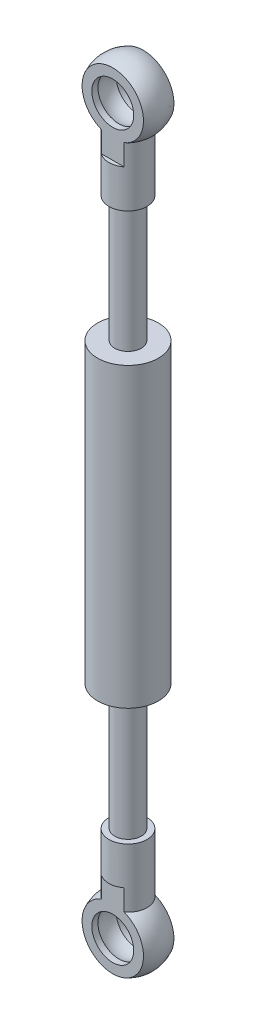
ISO-10303-21;
HEADER;
FILE_DESCRIPTION(('STEP AP214'),'2;1');
FILE_NAME('part.step','',(''),(''),'','','');
FILE_SCHEMA(('AUTOMOTIVE_DESIGN { 1 0 10303 214 1 1 1 1 }'));
ENDSEC;
DATA;
#1=APPLICATION_CONTEXT('core data for automotive mechanical design processes');
#2=APPLICATION_PROTOCOL_DEFINITION('international standard','automotive_design',2000,#1);
#3=PRODUCT_CONTEXT('',#1,'mechanical');
#4=PRODUCT('Part','Part','',(#3));
#5=PRODUCT_RELATED_PRODUCT_CATEGORY('part','',(#4));
#6=PRODUCT_DEFINITION_FORMATION('','',#4);
#7=PRODUCT_DEFINITION_CONTEXT('part definition',#1,'design');
#8=PRODUCT_DEFINITION('design','',#6,#7);
#9=PRODUCT_DEFINITION_SHAPE('','',#8);
#10=(LENGTH_UNIT() NAMED_UNIT(*) SI_UNIT(.MILLI.,.METRE.));
#11=(NAMED_UNIT(*) PLANE_ANGLE_UNIT() SI_UNIT($,.RADIAN.));
#12=(NAMED_UNIT(*) SI_UNIT($,.STERADIAN.) SOLID_ANGLE_UNIT());
#13=UNCERTAINTY_MEASURE_WITH_UNIT(LENGTH_MEASURE(1.E-05),#10,'distance_accuracy_value','');
#14=(GEOMETRIC_REPRESENTATION_CONTEXT(3) GLOBAL_UNCERTAINTY_ASSIGNED_CONTEXT((#13)) GLOBAL_UNIT_ASSIGNED_CONTEXT((#10,
#11,#12)) REPRESENTATION_CONTEXT('',''));
#15=CARTESIAN_POINT('',(0.,0.,0.));
#16=DIRECTION('',(0.,0.,1.));
#17=DIRECTION('',(1.,0.,0.));
#18=AXIS2_PLACEMENT_3D('',#15,#16,#17);
#19=CARTESIAN_POINT('',(0.,-47.4999999999999,0.));
#20=DIRECTION('',(0.,-1.,0.));
#21=DIRECTION('',(1.,0.,0.));
#22=AXIS2_PLACEMENT_3D('',#19,#20,#21);
#23=SPHERICAL_SURFACE('',#22,4.49999999999999);
#24=CARTESIAN_POINT('',(1.51186213114404E-13,-43.758342613226,0.));
#25=DIRECTION('',(0.,-1.,0.));
#26=DIRECTION('',(1.,0.,0.));
#27=AXIS2_PLACEMENT_3D('',#24,#25,#26);
#28=CIRCLE('',#27,2.49999999999985);
#29=CARTESIAN_POINT('',(1.49999999999976,-43.758342613226,-2.00000000000012));
#30=VERTEX_POINT('',#29);
#31=CARTESIAN_POINT('',(1.49999999999996,-43.758342613226,2.00000000000001));
#32=VERTEX_POINT('',#31);
#33=EDGE_CURVE('E133',#30,#32,#28,.T.);
#34=ORIENTED_EDGE('',*,*,#33,.T.);
#35=CARTESIAN_POINT('',(0.,-47.4999999999999,2.00000000000001));
#36=DIRECTION('',(0.,0.,-1.));
#37=DIRECTION('',(0.,1.,0.));
#38=AXIS2_PLACEMENT_3D('',#35,#36,#37);
#39=CIRCLE('',#38,4.03112887414926);
#40=CARTESIAN_POINT('',(-1.49999999999946,-43.758342613226,2.00000000000012));
#41=VERTEX_POINT('',#40);
#42=EDGE_CURVE('E186',#32,#41,#39,.T.);
#43=ORIENTED_EDGE('',*,*,#42,.T.);
#44=CARTESIAN_POINT('',(-1.49999999999982,-43.758342613226,-2.00000000000001));
#45=VERTEX_POINT('',#44);
#46=EDGE_CURVE('E128',#41,#45,#28,.T.);
#47=ORIENTED_EDGE('',*,*,#46,.T.);
#48=CARTESIAN_POINT('',(0.,-47.4999999999999,-2.00000000000001));
#49=DIRECTION('',(0.,0.,1.));
#50=DIRECTION('',(0.,-1.,0.));
#51=AXIS2_PLACEMENT_3D('',#48,#49,#50);
#52=CIRCLE('',#51,4.03112887414926);
#53=EDGE_CURVE('E179',#45,#30,#52,.T.);
#54=ORIENTED_EDGE('',*,*,#53,.T.);
#55=EDGE_LOOP('',(#34,#43,#47,#54));
#56=FACE_BOUND('',#55,.T.);
#57=ADVANCED_FACE('F41',(#56),#23,.T.);
#58=CARTESIAN_POINT('',(3.43133320105825E-12,-1000.,0.));
#59=DIRECTION('',(0.,-1.,0.));
#60=DIRECTION('',(1.,0.,0.));
#61=AXIS2_PLACEMENT_3D('',#58,#59,#60);
#62=CYLINDRICAL_SURFACE('',#61,2.49999999999986);
#63=DIRECTION('',(0.,-1.,0.));
#64=VECTOR('',#63,1.);
#65=CARTESIAN_POINT('',(1.50000000000304,-1000.,2.00000000000012));
#66=LINE('',#65,#64);
#67=CARTESIAN_POINT('',(1.49999999999976,-41.,2.00000000000001));
#68=VERTEX_POINT('',#67);
#69=EDGE_CURVE('E189',#32,#68,#66,.F.);
#70=ORIENTED_EDGE('',*,*,#69,.F.);
#71=ORIENTED_EDGE('',*,*,#33,.F.);
#72=DIRECTION('',(0.,-1.,0.));
#73=VECTOR('',#72,1.);
#74=CARTESIAN_POINT('',(1.50000000000304,-1000.,-2.00000000000012));
#75=LINE('',#74,#73);
#76=CARTESIAN_POINT('',(1.4999999999999,-41.,-2.00000000000001));
#77=VERTEX_POINT('',#76);
#78=EDGE_CURVE('E177',#77,#30,#75,.T.);
#79=ORIENTED_EDGE('',*,*,#78,.F.);
#80=CARTESIAN_POINT('',(1.41724411126802E-13,-41.,0.));
#81=DIRECTION('',(0.,1.,0.));
#82=DIRECTION('',(0.,0.,1.));
#83=AXIS2_PLACEMENT_3D('',#80,#81,#82);
#84=CIRCLE('',#83,2.49999999999986);
#85=CARTESIAN_POINT('',(-1.49999999999962,-41.,-2.00000000000001));
#86=VERTEX_POINT('',#85);
#87=EDGE_CURVE('E49',#86,#77,#84,.F.);
#88=ORIENTED_EDGE('',*,*,#87,.F.);
#89=DIRECTION('',(0.,-1.,0.));
#90=VECTOR('',#89,1.);
#91=CARTESIAN_POINT('',(-1.49999999999618,-1000.,-2.00000000000012));
#92=LINE('',#91,#90);
#93=EDGE_CURVE('E182',#45,#86,#92,.F.);
#94=ORIENTED_EDGE('',*,*,#93,.F.);
#95=ORIENTED_EDGE('',*,*,#46,.F.);
#96=DIRECTION('',(0.,-1.,0.));
#97=VECTOR('',#96,1.);
#98=CARTESIAN_POINT('',(-1.49999999999618,-1000.,2.00000000000012));
#99=LINE('',#98,#97);
#100=CARTESIAN_POINT('',(-1.49999999999947,-41.,2.00000000000012));
#101=VERTEX_POINT('',#100);
#102=EDGE_CURVE('E184',#101,#41,#99,.T.);
#103=ORIENTED_EDGE('',*,*,#102,.F.);
#104=CARTESIAN_POINT('',(1.41724411126802E-13,-41.,0.));
#105=DIRECTION('',(0.,1.,0.));
#106=DIRECTION('',(0.,0.,1.));
#107=AXIS2_PLACEMENT_3D('',#104,#105,#106);
#108=CIRCLE('',#107,2.49999999999986);
#109=EDGE_CURVE('E11',#68,#101,#108,.F.);
#110=ORIENTED_EDGE('',*,*,#109,.F.);
#111=EDGE_LOOP('',(#70,#71,#79,#88,#94,#95,#103,#110));
#112=FACE_BOUND('',#111,.T.);
#113=CARTESIAN_POINT('',(1.24573166132373E-13,-36.,0.));
#114=DIRECTION('',(0.,-1.,0.));
#115=DIRECTION('',(1.,0.,0.));
#116=AXIS2_PLACEMENT_3D('',#113,#114,#115);
#117=CIRCLE('',#116,2.49999999999988);
#118=CARTESIAN_POINT('',(2.5,-36.,0.));
#119=VERTEX_POINT('',#118);
#120=EDGE_CURVE('E214',#119,#119,#117,.T.);
#121=ORIENTED_EDGE('',*,*,#120,.T.);
#122=EDGE_LOOP('',(#121));
#123=FACE_BOUND('',#122,.T.);
#124=ADVANCED_FACE('F225',(#112,#123),#62,.T.);
#125=CARTESIAN_POINT('',(0.,-36.,0.));
#126=DIRECTION('',(0.,-1.,0.));
#127=DIRECTION('',(1.,0.,0.));
#128=AXIS2_PLACEMENT_3D('',#125,#126,#127);
#129=PLANE('',#128);
#130=ORIENTED_EDGE('',*,*,#120,.F.);
#131=EDGE_LOOP('',(#130));
#132=FACE_BOUND('',#131,.T.);
#133=CARTESIAN_POINT('',(1.24573166132373E-13,-36.,0.));
#134=DIRECTION('',(0.,-1.,0.));
#135=DIRECTION('',(1.,0.,0.));
#136=AXIS2_PLACEMENT_3D('',#133,#134,#135);
#137=CIRCLE('',#136,1.74999999999988);
#138=CARTESIAN_POINT('',(1.75,-36.,0.));
#139=VERTEX_POINT('',#138);
#140=EDGE_CURVE('E212',#139,#139,#137,.T.);
#141=ORIENTED_EDGE('',*,*,#140,.T.);
#142=EDGE_LOOP('',(#141));
#143=FACE_BOUND('',#142,.T.);
#144=ADVANCED_FACE('F254',(#132,#143),#129,.F.);
#145=CARTESIAN_POINT('',(3.43133320105825E-12,-1000.,0.));
#146=DIRECTION('',(0.,-1.,0.));
#147=DIRECTION('',(1.,0.,0.));
#148=AXIS2_PLACEMENT_3D('',#145,#146,#147);
#149=CYLINDRICAL_SURFACE('',#148,1.7499999999999);
#150=ORIENTED_EDGE('',*,*,#140,.F.);
#151=EDGE_LOOP('',(#150));
#152=FACE_BOUND('',#151,.T.);
#153=CARTESIAN_POINT('',(0.,-19.5,0.));
#154=DIRECTION('',(0.,-1.,0.));
#155=DIRECTION('',(1.,0.,0.));
#156=AXIS2_PLACEMENT_3D('',#153,#154,#155);
#157=CIRCLE('',#156,1.74999999999993);
#158=CARTESIAN_POINT('',(1.75,-19.5,0.));
#159=VERTEX_POINT('',#158);
#160=EDGE_CURVE('E209',#159,#159,#157,.T.);
#161=ORIENTED_EDGE('',*,*,#160,.T.);
#162=EDGE_LOOP('',(#161));
#163=FACE_BOUND('',#162,.T.);
#164=ADVANCED_FACE('F259',(#152,#163),#149,.T.);
#165=CARTESIAN_POINT('',(0.,-19.5,0.));
#166=DIRECTION('',(0.,-1.,0.));
#167=DIRECTION('',(1.,0.,0.));
#168=AXIS2_PLACEMENT_3D('',#165,#166,#167);
#169=PLANE('',#168);
#170=CARTESIAN_POINT('',(0.,-19.5,0.));
#171=DIRECTION('',(0.,-1.,0.));
#172=DIRECTION('',(1.,0.,0.));
#173=AXIS2_PLACEMENT_3D('',#170,#171,#172);
#174=CIRCLE('',#173,3.99999999999994);
#175=CARTESIAN_POINT('',(4.,-19.4999999999999,0.));
#176=VERTEX_POINT('',#175);
#177=EDGE_CURVE('E206',#176,#176,#174,.T.);
#178=ORIENTED_EDGE('',*,*,#177,.T.);
#179=EDGE_LOOP('',(#178));
#180=FACE_BOUND('',#179,.T.);
#181=ORIENTED_EDGE('',*,*,#160,.F.);
#182=EDGE_LOOP('',(#181));
#183=FACE_BOUND('',#182,.T.);
#184=ADVANCED_FACE('F265',(#180,#183),#169,.T.);
#185=CARTESIAN_POINT('',(3.43133320105825E-12,-1000.,0.));
#186=DIRECTION('',(0.,-1.,0.));
#187=DIRECTION('',(1.,0.,0.));
#188=AXIS2_PLACEMENT_3D('',#185,#186,#187);
#189=CYLINDRICAL_SURFACE('',#188,4.);
#190=ORIENTED_EDGE('',*,*,#177,.F.);
#191=EDGE_LOOP('',(#190));
#192=FACE_BOUND('',#191,.T.);
#193=CARTESIAN_POINT('',(0.,19.5000000000001,0.));
#194=DIRECTION('',(0.,-1.,0.));
#195=DIRECTION('',(1.,0.,0.));
#196=AXIS2_PLACEMENT_3D('',#193,#194,#195);
#197=CIRCLE('',#196,4.00000000000006);
#198=CARTESIAN_POINT('',(4.,19.5000000000001,0.));
#199=VERTEX_POINT('',#198);
#200=EDGE_CURVE('E203',#199,#199,#197,.T.);
#201=ORIENTED_EDGE('',*,*,#200,.T.);
#202=EDGE_LOOP('',(#201));
#203=FACE_BOUND('',#202,.T.);
#204=ADVANCED_FACE('F269',(#192,#203),#189,.T.);
#205=CARTESIAN_POINT('',(0.,19.5,0.));
#206=DIRECTION('',(0.,-1.,0.));
#207=DIRECTION('',(1.,0.,0.));
#208=AXIS2_PLACEMENT_3D('',#205,#206,#207);
#209=PLANE('',#208);
#210=ORIENTED_EDGE('',*,*,#200,.F.);
#211=EDGE_LOOP('',(#210));
#212=FACE_BOUND('',#211,.T.);
#213=CARTESIAN_POINT('',(0.,19.5000000000001,0.));
#214=DIRECTION('',(0.,-1.,0.));
#215=DIRECTION('',(1.,0.,0.));
#216=AXIS2_PLACEMENT_3D('',#213,#214,#215);
#217=CIRCLE('',#216,1.75000000000007);
#218=CARTESIAN_POINT('',(1.75,19.5000000000001,0.));
#219=VERTEX_POINT('',#218);
#220=EDGE_CURVE('E200',#219,#219,#217,.T.);
#221=ORIENTED_EDGE('',*,*,#220,.T.);
#222=EDGE_LOOP('',(#221));
#223=FACE_BOUND('',#222,.T.);
#224=ADVANCED_FACE('F273',(#212,#223),#209,.F.);
#225=CARTESIAN_POINT('',(3.43133320105825E-12,-1000.,0.));
#226=DIRECTION('',(0.,-1.,0.));
#227=DIRECTION('',(1.,0.,0.));
#228=AXIS2_PLACEMENT_3D('',#225,#226,#227);
#229=CYLINDRICAL_SURFACE('',#228,1.75000000000009);
#230=ORIENTED_EDGE('',*,*,#220,.F.);
#231=EDGE_LOOP('',(#230));
#232=FACE_BOUND('',#231,.T.);
#233=CARTESIAN_POINT('',(-1.22404761787402E-13,36.,0.));
#234=DIRECTION('',(0.,-1.,0.));
#235=DIRECTION('',(1.,0.,0.));
#236=AXIS2_PLACEMENT_3D('',#233,#234,#235);
#237=CIRCLE('',#236,1.75000000000012);
#238=CARTESIAN_POINT('',(1.75,36.,0.));
#239=VERTEX_POINT('',#238);
#240=EDGE_CURVE('E197',#239,#239,#237,.T.);
#241=ORIENTED_EDGE('',*,*,#240,.T.);
#242=EDGE_LOOP('',(#241));
#243=FACE_BOUND('',#242,.T.);
#244=ADVANCED_FACE('F277',(#232,#243),#229,.T.);
#245=CARTESIAN_POINT('',(0.,36.,0.));
#246=DIRECTION('',(0.,-1.,0.));
#247=DIRECTION('',(1.,0.,0.));
#248=AXIS2_PLACEMENT_3D('',#245,#246,#247);
#249=PLANE('',#248);
#250=CARTESIAN_POINT('',(-1.22404761787402E-13,36.,0.));
#251=DIRECTION('',(0.,-1.,0.));
#252=DIRECTION('',(1.,0.,0.));
#253=AXIS2_PLACEMENT_3D('',#250,#251,#252);
#254=CIRCLE('',#253,2.50000000000012);
#255=CARTESIAN_POINT('',(2.5,36.,0.));
#256=VERTEX_POINT('',#255);
#257=EDGE_CURVE('E194',#256,#256,#254,.T.);
#258=ORIENTED_EDGE('',*,*,#257,.T.);
#259=EDGE_LOOP('',(#258));
#260=FACE_BOUND('',#259,.T.);
#261=ORIENTED_EDGE('',*,*,#240,.F.);
#262=EDGE_LOOP('',(#261));
#263=FACE_BOUND('',#262,.T.);
#264=ADVANCED_FACE('F281',(#260,#263),#249,.T.);
#265=CARTESIAN_POINT('',(3.43133320105825E-12,-1000.,0.));
#266=DIRECTION('',(0.,-1.,0.));
#267=DIRECTION('',(1.,0.,0.));
#268=AXIS2_PLACEMENT_3D('',#265,#266,#267);
#269=CYLINDRICAL_SURFACE('',#268,2.50000000000014);
#270=CARTESIAN_POINT('',(-1.49017808769434E-13,43.758342613226,0.));
#271=DIRECTION('',(0.,-1.,0.));
#272=DIRECTION('',(1.,0.,0.));
#273=AXIS2_PLACEMENT_3D('',#270,#271,#272);
#274=CIRCLE('',#273,2.50000000000015);
#275=CARTESIAN_POINT('',(-1.50000000000022,43.758342613226,2.00000000000001));
#276=VERTEX_POINT('',#275);
#277=CARTESIAN_POINT('',(-1.50000000000022,43.758342613226,-2.00000000000001));
#278=VERTEX_POINT('',#277);
#279=EDGE_CURVE('E193',#276,#278,#274,.T.);
#280=ORIENTED_EDGE('',*,*,#279,.T.);
#281=DIRECTION('',(0.,-1.,0.));
#282=VECTOR('',#281,1.);
#283=CARTESIAN_POINT('',(-1.49999999999695,-1000.,-1.99999999999989));
#284=LINE('',#283,#282);
#285=CARTESIAN_POINT('',(-1.50000000000052,41.,-2.00000000000001));
#286=VERTEX_POINT('',#285);
#287=EDGE_CURVE('E174',#278,#286,#284,.T.);
#288=ORIENTED_EDGE('',*,*,#287,.T.);
#289=CARTESIAN_POINT('',(-1.39556006781831E-13,40.9999999999999,0.));
#290=DIRECTION('',(0.,-1.,0.));
#291=DIRECTION('',(0.,0.,-1.));
#292=AXIS2_PLACEMENT_3D('',#289,#290,#291);
#293=CIRCLE('',#292,2.50000000000014);
#294=CARTESIAN_POINT('',(1.50000000000024,41.,-2.00000000000001));
#295=VERTEX_POINT('',#294);
#296=EDGE_CURVE('E127',#286,#295,#293,.T.);
#297=ORIENTED_EDGE('',*,*,#296,.T.);
#298=DIRECTION('',(0.,-1.,0.));
#299=VECTOR('',#298,1.);
#300=CARTESIAN_POINT('',(1.50000000000381,-1000.,-1.99999999999989));
#301=LINE('',#300,#299);
#302=CARTESIAN_POINT('',(1.50000000000009,43.758342613226,-2.00000000000001));
#303=VERTEX_POINT('',#302);
#304=EDGE_CURVE('E171',#295,#303,#301,.F.);
#305=ORIENTED_EDGE('',*,*,#304,.T.);
#306=CARTESIAN_POINT('',(1.50000000000009,43.758342613226,2.00000000000001));
#307=VERTEX_POINT('',#306);
#308=EDGE_CURVE('E191',#303,#307,#274,.T.);
#309=ORIENTED_EDGE('',*,*,#308,.T.);
#310=DIRECTION('',(0.,-1.,0.));
#311=VECTOR('',#310,1.);
#312=CARTESIAN_POINT('',(1.50000000000381,-1000.,1.99999999999989));
#313=LINE('',#312,#311);
#314=CARTESIAN_POINT('',(1.50000000000008,40.9999999999999,2.00000000000001));
#315=VERTEX_POINT('',#314);
#316=EDGE_CURVE('E117',#307,#315,#313,.T.);
#317=ORIENTED_EDGE('',*,*,#316,.T.);
#318=CARTESIAN_POINT('',(-1.39556006781831E-13,40.9999999999999,0.));
#319=DIRECTION('',(0.,-1.,0.));
#320=DIRECTION('',(0.,0.,-1.));
#321=AXIS2_PLACEMENT_3D('',#318,#319,#320);
#322=CIRCLE('',#321,2.50000000000014);
#323=CARTESIAN_POINT('',(-1.50000000000036,40.9999999999999,2.00000000000001));
#324=VERTEX_POINT('',#323);
#325=EDGE_CURVE('E121',#315,#324,#322,.T.);
#326=ORIENTED_EDGE('',*,*,#325,.T.);
#327=DIRECTION('',(0.,-1.,0.));
#328=VECTOR('',#327,1.);
#329=CARTESIAN_POINT('',(-1.49999999999695,-1000.,1.99999999999989));
#330=LINE('',#329,#328);
#331=EDGE_CURVE('E106',#324,#276,#330,.F.);
#332=ORIENTED_EDGE('',*,*,#331,.T.);
#333=EDGE_LOOP('',(#280,#288,#297,#305,#309,#317,#326,#332));
#334=FACE_BOUND('',#333,.T.);
#335=ORIENTED_EDGE('',*,*,#257,.F.);
#336=EDGE_LOOP('',(#335));
#337=FACE_BOUND('',#336,.T.);
#338=ADVANCED_FACE('F124',(#334,#337),#269,.T.);
#339=CARTESIAN_POINT('',(0.,47.4999999999999,0.));
#340=DIRECTION('',(0.,-1.,0.));
#341=DIRECTION('',(1.,0.,0.));
#342=AXIS2_PLACEMENT_3D('',#339,#340,#341);
#343=SPHERICAL_SURFACE('',#342,4.5);
#344=CARTESIAN_POINT('',(0.,47.4999999999999,-2.00000000000001));
#345=DIRECTION('',(0.,0.,1.));
#346=DIRECTION('',(0.,-1.,0.));
#347=AXIS2_PLACEMENT_3D('',#344,#345,#346);
#348=CIRCLE('',#347,4.03112887414927);
#349=EDGE_CURVE('E169',#278,#303,#348,.F.);
#350=ORIENTED_EDGE('',*,*,#349,.F.);
#351=ORIENTED_EDGE('',*,*,#279,.F.);
#352=CARTESIAN_POINT('',(0.,47.4999999999999,2.00000000000001));
#353=DIRECTION('',(0.,0.,-1.));
#354=DIRECTION('',(0.,1.,0.));
#355=AXIS2_PLACEMENT_3D('',#352,#353,#354);
#356=CIRCLE('',#355,4.03112887414927);
#357=EDGE_CURVE('E112',#307,#276,#356,.F.);
#358=ORIENTED_EDGE('',*,*,#357,.F.);
#359=ORIENTED_EDGE('',*,*,#308,.F.);
#360=EDGE_LOOP('',(#350,#351,#358,#359));
#361=FACE_BOUND('',#360,.T.);
#362=ADVANCED_FACE('F286',(#361),#343,.T.);
#363=CARTESIAN_POINT('',(-4.5,41.,2.00000000000001));
#364=DIRECTION('',(0.,-1.,0.));
#365=DIRECTION('',(0.,0.,-1.));
#366=AXIS2_PLACEMENT_3D('',#363,#364,#365);
#367=PLANE('',#366);
#368=DIRECTION('',(1.,0.,0.));
#369=VECTOR('',#368,1.);
#370=CARTESIAN_POINT('',(-4.5,41.,2.00000000000001));
#371=LINE('',#370,#369);
#372=EDGE_CURVE('E109',#324,#315,#371,.T.);
#373=ORIENTED_EDGE('',*,*,#372,.F.);
#374=ORIENTED_EDGE('',*,*,#325,.F.);
#375=EDGE_LOOP('',(#373,#374));
#376=FACE_BOUND('',#375,.T.);
#377=ADVANCED_FACE('F120',(#376),#367,.F.);
#378=CARTESIAN_POINT('',(-4.5,56.,2.00000000000001));
#379=DIRECTION('',(0.,0.,-1.));
#380=DIRECTION('',(0.,1.,0.));
#381=AXIS2_PLACEMENT_3D('',#378,#379,#380);
#382=PLANE('',#381);
#383=CARTESIAN_POINT('',(0.,47.4999999999999,2.00000000000001));
#384=DIRECTION('',(0.,0.,-1.));
#385=DIRECTION('',(0.,1.,0.));
#386=AXIS2_PLACEMENT_3D('',#383,#384,#385);
#387=CIRCLE('',#386,2.75);
#388=CARTESIAN_POINT('',(2.75,47.4999999999999,2.00000000000001));
#389=VERTEX_POINT('',#388);
#390=EDGE_CURVE('E160',#389,#389,#387,.T.);
#391=ORIENTED_EDGE('',*,*,#390,.T.);
#392=EDGE_LOOP('',(#391));
#393=FACE_BOUND('',#392,.T.);
#394=ORIENTED_EDGE('',*,*,#357,.T.);
#395=ORIENTED_EDGE('',*,*,#331,.F.);
#396=ORIENTED_EDGE('',*,*,#372,.T.);
#397=ORIENTED_EDGE('',*,*,#316,.F.);
#398=EDGE_LOOP('',(#394,#395,#396,#397));
#399=FACE_BOUND('',#398,.T.);
#400=ADVANCED_FACE('F108',(#393,#399),#382,.F.);
#401=CARTESIAN_POINT('',(-4.5,41.,-2.00000000000001));
#402=DIRECTION('',(0.,-1.,0.));
#403=DIRECTION('',(0.,0.,-1.));
#404=AXIS2_PLACEMENT_3D('',#401,#402,#403);
#405=PLANE('',#404);
#406=DIRECTION('',(1.,0.,0.));
#407=VECTOR('',#406,1.);
#408=CARTESIAN_POINT('',(-4.5,41.,-2.00000000000001));
#409=LINE('',#408,#407);
#410=EDGE_CURVE('E122',#286,#295,#409,.T.);
#411=ORIENTED_EDGE('',*,*,#410,.T.);
#412=ORIENTED_EDGE('',*,*,#296,.F.);
#413=EDGE_LOOP('',(#411,#412));
#414=FACE_BOUND('',#413,.T.);
#415=ADVANCED_FACE('F245',(#414),#405,.F.);
#416=CARTESIAN_POINT('',(-4.5,56.,-2.00000000000001));
#417=DIRECTION('',(0.,0.,1.));
#418=DIRECTION('',(0.,-1.,0.));
#419=AXIS2_PLACEMENT_3D('',#416,#417,#418);
#420=PLANE('',#419);
#421=CARTESIAN_POINT('',(0.,47.4999999999999,-2.00000000000001));
#422=DIRECTION('',(0.,0.,1.));
#423=DIRECTION('',(0.,-1.,0.));
#424=AXIS2_PLACEMENT_3D('',#421,#422,#423);
#425=CIRCLE('',#424,2.75);
#426=CARTESIAN_POINT('',(2.75,47.4999999999999,-2.00000000000001));
#427=VERTEX_POINT('',#426);
#428=EDGE_CURVE('E150',#427,#427,#425,.T.);
#429=ORIENTED_EDGE('',*,*,#428,.T.);
#430=EDGE_LOOP('',(#429));
#431=FACE_BOUND('',#430,.T.);
#432=ORIENTED_EDGE('',*,*,#349,.T.);
#433=ORIENTED_EDGE('',*,*,#304,.F.);
#434=ORIENTED_EDGE('',*,*,#410,.F.);
#435=ORIENTED_EDGE('',*,*,#287,.F.);
#436=EDGE_LOOP('',(#432,#433,#434,#435));
#437=FACE_BOUND('',#436,.T.);
#438=ADVANCED_FACE('F237',(#431,#437),#420,.F.);
#439=CARTESIAN_POINT('',(-4.5,-56.,-2.00000000000001));
#440=DIRECTION('',(0.,0.,1.));
#441=DIRECTION('',(0.,-1.,0.));
#442=AXIS2_PLACEMENT_3D('',#439,#440,#441);
#443=PLANE('',#442);
#444=CARTESIAN_POINT('',(0.,-47.4999999999999,-2.00000000000001));
#445=DIRECTION('',(0.,0.,1.));
#446=DIRECTION('',(0.,-1.,0.));
#447=AXIS2_PLACEMENT_3D('',#444,#445,#446);
#448=CIRCLE('',#447,2.75);
#449=CARTESIAN_POINT('',(2.75,-47.4999999999999,-2.00000000000001));
#450=VERTEX_POINT('',#449);
#451=EDGE_CURVE('E146',#450,#450,#448,.T.);
#452=ORIENTED_EDGE('',*,*,#451,.T.);
#453=EDGE_LOOP('',(#452));
#454=FACE_BOUND('',#453,.T.);
#455=ORIENTED_EDGE('',*,*,#93,.T.);
#456=DIRECTION('',(1.,0.,0.));
#457=VECTOR('',#456,1.);
#458=CARTESIAN_POINT('',(-4.5,-41.,-2.00000000000001));
#459=LINE('',#458,#457);
#460=EDGE_CURVE('E63',#86,#77,#459,.T.);
#461=ORIENTED_EDGE('',*,*,#460,.T.);
#462=ORIENTED_EDGE('',*,*,#78,.T.);
#463=ORIENTED_EDGE('',*,*,#53,.F.);
#464=EDGE_LOOP('',(#455,#461,#462,#463));
#465=FACE_BOUND('',#464,.T.);
#466=ADVANCED_FACE('F234',(#454,#465),#443,.F.);
#467=CARTESIAN_POINT('',(-4.5,-41.,-2.00000000000001));
#468=DIRECTION('',(0.,1.,0.));
#469=DIRECTION('',(0.,0.,1.));
#470=AXIS2_PLACEMENT_3D('',#467,#468,#469);
#471=PLANE('',#470);
#472=ORIENTED_EDGE('',*,*,#87,.T.);
#473=ORIENTED_EDGE('',*,*,#460,.F.);
#474=EDGE_LOOP('',(#472,#473));
#475=FACE_BOUND('',#474,.T.);
#476=ADVANCED_FACE('F236',(#475),#471,.F.);
#477=CARTESIAN_POINT('',(-4.5,-56.,2.00000000000001));
#478=DIRECTION('',(0.,0.,-1.));
#479=DIRECTION('',(0.,1.,0.));
#480=AXIS2_PLACEMENT_3D('',#477,#478,#479);
#481=PLANE('',#480);
#482=CARTESIAN_POINT('',(0.,-47.4999999999999,2.00000000000001));
#483=DIRECTION('',(0.,0.,-1.));
#484=DIRECTION('',(0.,1.,0.));
#485=AXIS2_PLACEMENT_3D('',#482,#483,#484);
#486=CIRCLE('',#485,2.75);
#487=CARTESIAN_POINT('',(2.75,-47.4999999999999,2.00000000000001));
#488=VERTEX_POINT('',#487);
#489=EDGE_CURVE('E143',#488,#488,#486,.T.);
#490=ORIENTED_EDGE('',*,*,#489,.T.);
#491=EDGE_LOOP('',(#490));
#492=FACE_BOUND('',#491,.T.);
#493=ORIENTED_EDGE('',*,*,#69,.T.);
#494=DIRECTION('',(1.,0.,0.));
#495=VECTOR('',#494,1.);
#496=CARTESIAN_POINT('',(-4.5,-41.,2.00000000000001));
#497=LINE('',#496,#495);
#498=EDGE_CURVE('E57',#101,#68,#497,.T.);
#499=ORIENTED_EDGE('',*,*,#498,.F.);
#500=ORIENTED_EDGE('',*,*,#102,.T.);
#501=ORIENTED_EDGE('',*,*,#42,.F.);
#502=EDGE_LOOP('',(#493,#499,#500,#501));
#503=FACE_BOUND('',#502,.T.);
#504=ADVANCED_FACE('F229',(#492,#503),#481,.F.);
#505=CARTESIAN_POINT('',(-4.5,-41.,2.00000000000001));
#506=DIRECTION('',(0.,1.,0.));
#507=DIRECTION('',(0.,0.,1.));
#508=AXIS2_PLACEMENT_3D('',#505,#506,#507);
#509=PLANE('',#508);
#510=ORIENTED_EDGE('',*,*,#109,.T.);
#511=ORIENTED_EDGE('',*,*,#498,.T.);
#512=EDGE_LOOP('',(#510,#511));
#513=FACE_BOUND('',#512,.T.);
#514=ADVANCED_FACE('F231',(#513),#509,.F.);
#515=CARTESIAN_POINT('',(0.,-47.4999999999999,-4.00000000000006));
#516=DIRECTION('',(0.,0.,1.));
#517=DIRECTION('',(1.,0.,0.));
#518=AXIS2_PLACEMENT_3D('',#515,#516,#517);
#519=CYLINDRICAL_SURFACE('',#518,2.75);
#520=CARTESIAN_POINT('',(0.,-47.4999999999999,-1.19895788082818));
#521=DIRECTION('',(0.,0.,1.));
#522=DIRECTION('',(1.,0.,0.));
#523=AXIS2_PLACEMENT_3D('',#520,#521,#522);
#524=CIRCLE('',#523,2.75);
#525=CARTESIAN_POINT('',(2.75,-47.4999999999999,-1.19895788082818));
#526=VERTEX_POINT('',#525);
#527=EDGE_CURVE('E138',#526,#526,#524,.F.);
#528=CARTESIAN_POINT('',(2.75,-47.4999999999999,-1.19895788082818));
#529=CARTESIAN_POINT('',(2.75,-47.4999999999999,-1.20730206956956));
#530=CARTESIAN_POINT('',(2.75,-47.4999999999999,-1.21564625831093));
#531=CARTESIAN_POINT('',(2.75,-47.4999999999999,-1.23233463579368));
#532=CARTESIAN_POINT('',(2.75,-47.4999999999999,-1.24067882453505));
#533=CARTESIAN_POINT('',(2.75,-47.4999999999999,-1.2573672020178));
#534=CARTESIAN_POINT('',(2.75,-47.4999999999999,-1.26571139075917));
#535=CARTESIAN_POINT('',(2.75,-47.4999999999999,-1.28239976824192));
#536=CARTESIAN_POINT('',(2.75,-47.4999999999999,-1.29074395698329));
#537=CARTESIAN_POINT('',(2.75,-47.4999999999999,-1.30743233446603));
#538=CARTESIAN_POINT('',(2.75,-47.4999999999999,-1.31577652320741));
#539=CARTESIAN_POINT('',(2.75,-47.4999999999999,-1.33246490069015));
#540=CARTESIAN_POINT('',(2.75,-47.4999999999999,-1.34080908943153));
#541=CARTESIAN_POINT('',(2.75,-47.4999999999999,-1.35749746691427));
#542=CARTESIAN_POINT('',(2.75,-47.4999999999999,-1.36584165565565));
#543=CARTESIAN_POINT('',(2.75,-47.4999999999999,-1.38253003313839));
#544=CARTESIAN_POINT('',(2.75,-47.4999999999999,-1.39087422187977));
#545=CARTESIAN_POINT('',(2.75,-47.4999999999999,-1.40756259936251));
#546=CARTESIAN_POINT('',(2.75,-47.4999999999999,-1.41590678810389));
#547=CARTESIAN_POINT('',(2.75,-47.4999999999999,-1.43259516558663));
#548=CARTESIAN_POINT('',(2.75,-47.4999999999999,-1.44093935432801));
#549=CARTESIAN_POINT('',(2.75,-47.4999999999999,-1.45762773181075));
#550=CARTESIAN_POINT('',(2.75,-47.4999999999999,-1.46597192055212));
#551=CARTESIAN_POINT('',(2.75,-47.4999999999999,-1.48266029803487));
#552=CARTESIAN_POINT('',(2.75,-47.4999999999999,-1.49100448677624));
#553=CARTESIAN_POINT('',(2.75,-47.4999999999999,-1.50769286425899));
#554=CARTESIAN_POINT('',(2.75,-47.4999999999999,-1.51603705300036));
#555=CARTESIAN_POINT('',(2.75,-47.4999999999999,-1.53272543048311));
#556=CARTESIAN_POINT('',(2.75,-47.4999999999999,-1.54106961922448));
#557=CARTESIAN_POINT('',(2.75,-47.4999999999999,-1.55775799670723));
#558=CARTESIAN_POINT('',(2.75,-47.4999999999999,-1.5661021854486));
#559=CARTESIAN_POINT('',(2.75,-47.4999999999999,-1.58279056293135));
#560=CARTESIAN_POINT('',(2.75,-47.4999999999999,-1.59113475167272));
#561=CARTESIAN_POINT('',(2.75,-47.4999999999999,-1.60782312915547));
#562=CARTESIAN_POINT('',(2.75,-47.4999999999999,-1.61616731789684));
#563=CARTESIAN_POINT('',(2.75,-47.4999999999999,-1.63285569537959));
#564=CARTESIAN_POINT('',(2.75,-47.4999999999999,-1.64119988412096));
#565=CARTESIAN_POINT('',(2.75,-47.4999999999999,-1.65788826160371));
#566=CARTESIAN_POINT('',(2.75,-47.4999999999999,-1.66623245034508));
#567=CARTESIAN_POINT('',(2.75,-47.4999999999999,-1.68292082782783));
#568=CARTESIAN_POINT('',(2.75,-47.4999999999999,-1.6912650165692));
#569=CARTESIAN_POINT('',(2.75,-47.4999999999999,-1.70795339405195));
#570=CARTESIAN_POINT('',(2.75,-47.4999999999999,-1.71629758279332));
#571=CARTESIAN_POINT('',(2.75,-47.4999999999999,-1.73298596027607));
#572=CARTESIAN_POINT('',(2.75,-47.4999999999999,-1.74133014901744));
#573=CARTESIAN_POINT('',(2.75,-47.4999999999999,-1.75801852650019));
#574=CARTESIAN_POINT('',(2.75,-47.4999999999999,-1.76636271524156));
#575=CARTESIAN_POINT('',(2.75,-47.4999999999999,-1.7830510927243));
#576=CARTESIAN_POINT('',(2.75,-47.4999999999999,-1.79139528146568));
#577=CARTESIAN_POINT('',(2.75,-47.4999999999999,-1.80808365894842));
#578=CARTESIAN_POINT('',(2.75,-47.4999999999999,-1.8164278476898));
#579=CARTESIAN_POINT('',(2.75,-47.4999999999999,-1.83311622517254));
#580=CARTESIAN_POINT('',(2.75,-47.4999999999999,-1.84146041391392));
#581=CARTESIAN_POINT('',(2.75,-47.4999999999999,-1.85814879139666));
#582=CARTESIAN_POINT('',(2.75,-47.4999999999999,-1.86649298013804));
#583=CARTESIAN_POINT('',(2.75,-47.4999999999999,-1.88318135762078));
#584=CARTESIAN_POINT('',(2.75,-47.4999999999999,-1.89152554636216));
#585=CARTESIAN_POINT('',(2.75,-47.4999999999999,-1.9082139238449));
#586=CARTESIAN_POINT('',(2.75,-47.4999999999999,-1.91655811258627));
#587=CARTESIAN_POINT('',(2.75,-47.4999999999999,-1.93324649006902));
#588=CARTESIAN_POINT('',(2.75,-47.4999999999999,-1.94159067881039));
#589=CARTESIAN_POINT('',(2.75,-47.4999999999999,-1.95827905629314));
#590=CARTESIAN_POINT('',(2.75,-47.4999999999999,-1.96662324503451));
#591=CARTESIAN_POINT('',(2.75,-47.4999999999999,-1.98331162251726));
#592=CARTESIAN_POINT('',(2.75,-47.4999999999999,-1.99165581125863));
#593=CARTESIAN_POINT('',(2.75,-47.4999999999999,-2.00000000000001));
#594=B_SPLINE_CURVE_WITH_KNOTS('',3,(#528,#529,#530,#531,#532,#533,#534,#535,#536,#537,#538,
#539,#540,#541,#542,#543,#544,#545,#546,#547,#548,#549,#550,#551,#552,#553,#554,#555,#556,#557,
#558,#559,#560,#561,#562,#563,#564,#565,#566,#567,#568,#569,#570,#571,#572,#573,#574,#575,#576,
#577,#578,#579,#580,#581,#582,#583,#584,#585,#586,#587,#588,#589,#590,#591,#592,#593),
.UNSPECIFIED.,.F.,.F.,(4,2,2,2,2,2,2,2,2,2,2,2,2,2,2,2,2,2,2,2,2,2,2,2,2,2,2,2,2,2,2,2,4),(0.,
0.0250325662241196,0.0500651324482387,0.0750976986723584,0.100130264896478,0.125162831120597,
0.150195397344717,0.175227963568836,0.200260529792956,0.225293096017075,0.250325662241195,
0.275358228465314,0.300390794689433,0.325423360913553,0.350455927137673,0.375488493361792,
0.400521059585911,0.425553625810031,0.45058619203415,0.47561875825827,0.500651324482389,
0.525683890706508,0.550716456930628,0.575749023154748,0.600781589378867,0.625814155602986,
0.650846721827106,0.675879288051225,0.700911854275345,0.725944420499464,0.750976986723583,
0.776009552947703,0.801042119171823),.UNSPECIFIED.);
#595=EDGE_CURVE('BSEAM306',#526,#450,#594,.T.);
#596=ORIENTED_EDGE('',*,*,#527,.F.);
#597=ORIENTED_EDGE('',*,*,#451,.F.);
#598=ORIENTED_EDGE('',*,*,#595,.T.);
#599=ORIENTED_EDGE('',*,*,#595,.F.);
#600=EDGE_LOOP('',(#596,#598,#597,#599));
#601=FACE_BOUND('',#600,.T.);
#602=ADVANCED_FACE('F306',(#601),#519,.F.);
#603=CARTESIAN_POINT('',(0.,-47.4999999999999,1.19895788082818));
#604=DIRECTION('',(0.,0.,-1.));
#605=DIRECTION('',(-1.,0.,0.));
#606=AXIS2_PLACEMENT_3D('',#603,#604,#605);
#607=CIRCLE('',#606,2.75);
#608=CARTESIAN_POINT('',(2.75,-47.4999999999999,1.19895788082818));
#609=VERTEX_POINT('',#608);
#610=EDGE_CURVE('E141',#609,#609,#607,.F.);
#611=CARTESIAN_POINT('',(2.75,-47.4999999999999,1.19895788082818));
#612=CARTESIAN_POINT('',(2.75,-47.4999999999999,1.20730206956955));
#613=CARTESIAN_POINT('',(2.75,-47.4999999999999,1.21564625831093));
#614=CARTESIAN_POINT('',(2.75,-47.4999999999999,1.23233463579367));
#615=CARTESIAN_POINT('',(2.75,-47.4999999999999,1.24067882453505));
#616=CARTESIAN_POINT('',(2.75,-47.4999999999999,1.25736720201779));
#617=CARTESIAN_POINT('',(2.75,-47.4999999999999,1.26571139075917));
#618=CARTESIAN_POINT('',(2.75,-47.4999999999999,1.28239976824191));
#619=CARTESIAN_POINT('',(2.75,-47.4999999999999,1.29074395698329));
#620=CARTESIAN_POINT('',(2.75,-47.4999999999999,1.30743233446603));
#621=CARTESIAN_POINT('',(2.75,-47.4999999999999,1.3157765232074));
#622=CARTESIAN_POINT('',(2.75,-47.4999999999999,1.33246490069015));
#623=CARTESIAN_POINT('',(2.75,-47.4999999999999,1.34080908943152));
#624=CARTESIAN_POINT('',(2.75,-47.4999999999999,1.35749746691427));
#625=CARTESIAN_POINT('',(2.75,-47.4999999999999,1.36584165565564));
#626=CARTESIAN_POINT('',(2.75,-47.4999999999999,1.38253003313839));
#627=CARTESIAN_POINT('',(2.75,-47.4999999999999,1.39087422187976));
#628=CARTESIAN_POINT('',(2.75,-47.4999999999999,1.40756259936251));
#629=CARTESIAN_POINT('',(2.75,-47.4999999999999,1.41590678810388));
#630=CARTESIAN_POINT('',(2.75,-47.4999999999999,1.43259516558663));
#631=CARTESIAN_POINT('',(2.75,-47.4999999999999,1.440939354328));
#632=CARTESIAN_POINT('',(2.75,-47.4999999999999,1.45762773181075));
#633=CARTESIAN_POINT('',(2.75,-47.4999999999999,1.46597192055212));
#634=CARTESIAN_POINT('',(2.75,-47.4999999999999,1.48266029803487));
#635=CARTESIAN_POINT('',(2.75,-47.4999999999999,1.49100448677624));
#636=CARTESIAN_POINT('',(2.75,-47.4999999999999,1.50769286425899));
#637=CARTESIAN_POINT('',(2.75,-47.4999999999999,1.51603705300036));
#638=CARTESIAN_POINT('',(2.75,-47.4999999999999,1.53272543048311));
#639=CARTESIAN_POINT('',(2.75,-47.4999999999999,1.54106961922448));
#640=CARTESIAN_POINT('',(2.75,-47.4999999999999,1.55775799670723));
#641=CARTESIAN_POINT('',(2.75,-47.4999999999999,1.5661021854486));
#642=CARTESIAN_POINT('',(2.75,-47.4999999999999,1.58279056293135));
#643=CARTESIAN_POINT('',(2.75,-47.4999999999999,1.59113475167272));
#644=CARTESIAN_POINT('',(2.75,-47.4999999999999,1.60782312915547));
#645=CARTESIAN_POINT('',(2.75,-47.4999999999999,1.61616731789684));
#646=CARTESIAN_POINT('',(2.75,-47.4999999999999,1.63285569537959));
#647=CARTESIAN_POINT('',(2.75,-47.4999999999999,1.64119988412096));
#648=CARTESIAN_POINT('',(2.75,-47.4999999999999,1.65788826160371));
#649=CARTESIAN_POINT('',(2.75,-47.4999999999999,1.66623245034508));
#650=CARTESIAN_POINT('',(2.75,-47.4999999999999,1.68292082782783));
#651=CARTESIAN_POINT('',(2.75,-47.4999999999999,1.6912650165692));
#652=CARTESIAN_POINT('',(2.75,-47.4999999999999,1.70795339405194));
#653=CARTESIAN_POINT('',(2.75,-47.4999999999999,1.71629758279332));
#654=CARTESIAN_POINT('',(2.75,-47.4999999999999,1.73298596027606));
#655=CARTESIAN_POINT('',(2.75,-47.4999999999999,1.74133014901744));
#656=CARTESIAN_POINT('',(2.75,-47.4999999999999,1.75801852650018));
#657=CARTESIAN_POINT('',(2.75,-47.4999999999999,1.76636271524156));
#658=CARTESIAN_POINT('',(2.75,-47.4999999999999,1.7830510927243));
#659=CARTESIAN_POINT('',(2.75,-47.4999999999999,1.79139528146568));
#660=CARTESIAN_POINT('',(2.75,-47.4999999999999,1.80808365894842));
#661=CARTESIAN_POINT('',(2.75,-47.4999999999999,1.8164278476898));
#662=CARTESIAN_POINT('',(2.75,-47.4999999999999,1.83311622517254));
#663=CARTESIAN_POINT('',(2.75,-47.4999999999999,1.84146041391392));
#664=CARTESIAN_POINT('',(2.75,-47.4999999999999,1.85814879139666));
#665=CARTESIAN_POINT('',(2.75,-47.4999999999999,1.86649298013804));
#666=CARTESIAN_POINT('',(2.75,-47.4999999999999,1.88318135762078));
#667=CARTESIAN_POINT('',(2.75,-47.4999999999999,1.89152554636216));
#668=CARTESIAN_POINT('',(2.75,-47.4999999999999,1.9082139238449));
#669=CARTESIAN_POINT('',(2.75,-47.4999999999999,1.91655811258627));
#670=CARTESIAN_POINT('',(2.75,-47.4999999999999,1.93324649006902));
#671=CARTESIAN_POINT('',(2.75,-47.4999999999999,1.94159067881039));
#672=CARTESIAN_POINT('',(2.75,-47.4999999999999,1.95827905629314));
#673=CARTESIAN_POINT('',(2.75,-47.4999999999999,1.96662324503451));
#674=CARTESIAN_POINT('',(2.75,-47.4999999999999,1.98331162251726));
#675=CARTESIAN_POINT('',(2.75,-47.4999999999999,1.99165581125863));
#676=CARTESIAN_POINT('',(2.75,-47.4999999999999,2.00000000000001));
#677=B_SPLINE_CURVE_WITH_KNOTS('',3,(#611,#612,#613,#614,#615,#616,#617,#618,#619,#620,#621,
#622,#623,#624,#625,#626,#627,#628,#629,#630,#631,#632,#633,#634,#635,#636,#637,#638,#639,#640,
#641,#642,#643,#644,#645,#646,#647,#648,#649,#650,#651,#652,#653,#654,#655,#656,#657,#658,#659,
#660,#661,#662,#663,#664,#665,#666,#667,#668,#669,#670,#671,#672,#673,#674,#675,#676),
.UNSPECIFIED.,.F.,.F.,(4,2,2,2,2,2,2,2,2,2,2,2,2,2,2,2,2,2,2,2,2,2,2,2,2,2,2,2,2,2,2,2,4),(0.,
0.0250325662241192,0.0500651324482392,0.0750976986723592,0.100130264896478,0.125162831120598,
0.150195397344718,0.175227963568838,0.200260529792957,0.225293096017076,0.250325662241196,
0.275358228465316,0.300390794689435,0.325423360913554,0.350455927137674,0.375488493361794,
0.400521059585913,0.425553625810033,0.450586192034153,0.475618758258273,0.500651324482392,
0.525683890706511,0.550716456930631,0.575749023154751,0.60078158937887,0.625814155602989,
0.650846721827109,0.675879288051229,0.700911854275349,0.725944420499468,0.750976986723588,
0.776009552947708,0.801042119171827),.UNSPECIFIED.);
#678=EDGE_CURVE('BSEAM313',#609,#488,#677,.T.);
#679=ORIENTED_EDGE('',*,*,#610,.F.);
#680=ORIENTED_EDGE('',*,*,#489,.F.);
#681=ORIENTED_EDGE('',*,*,#678,.T.);
#682=ORIENTED_EDGE('',*,*,#678,.F.);
#683=EDGE_LOOP('',(#679,#681,#680,#682));
#684=FACE_BOUND('',#683,.T.);
#685=ADVANCED_FACE('F313',(#684),#519,.F.);
#686=CARTESIAN_POINT('',(0.,47.4999999999999,-4.00000000000006));
#687=DIRECTION('',(0.,0.,1.));
#688=DIRECTION('',(1.,0.,0.));
#689=AXIS2_PLACEMENT_3D('',#686,#687,#688);
#690=CYLINDRICAL_SURFACE('',#689,2.75);
#691=CARTESIAN_POINT('',(0.,47.4999999999999,-1.19895788082818));
#692=DIRECTION('',(0.,0.,1.));
#693=DIRECTION('',(1.,0.,0.));
#694=AXIS2_PLACEMENT_3D('',#691,#692,#693);
#695=CIRCLE('',#694,2.75);
#696=CARTESIAN_POINT('',(2.75,47.4999999999999,-1.19895788082818));
#697=VERTEX_POINT('',#696);
#698=EDGE_CURVE('E144',#697,#697,#695,.F.);
#699=CARTESIAN_POINT('',(2.75,47.4999999999999,-1.19895788082818));
#700=CARTESIAN_POINT('',(2.75,47.4999999999999,-1.20730206956956));
#701=CARTESIAN_POINT('',(2.75,47.4999999999999,-1.21564625831093));
#702=CARTESIAN_POINT('',(2.75,47.4999999999999,-1.23233463579368));
#703=CARTESIAN_POINT('',(2.75,47.4999999999999,-1.24067882453505));
#704=CARTESIAN_POINT('',(2.75,47.4999999999999,-1.2573672020178));
#705=CARTESIAN_POINT('',(2.75,47.4999999999999,-1.26571139075917));
#706=CARTESIAN_POINT('',(2.75,47.4999999999999,-1.28239976824192));
#707=CARTESIAN_POINT('',(2.75,47.4999999999999,-1.29074395698329));
#708=CARTESIAN_POINT('',(2.75,47.4999999999999,-1.30743233446603));
#709=CARTESIAN_POINT('',(2.75,47.4999999999999,-1.31577652320741));
#710=CARTESIAN_POINT('',(2.75,47.4999999999999,-1.33246490069015));
#711=CARTESIAN_POINT('',(2.75,47.4999999999999,-1.34080908943153));
#712=CARTESIAN_POINT('',(2.75,47.4999999999999,-1.35749746691427));
#713=CARTESIAN_POINT('',(2.75,47.4999999999999,-1.36584165565565));
#714=CARTESIAN_POINT('',(2.75,47.4999999999999,-1.38253003313839));
#715=CARTESIAN_POINT('',(2.75,47.4999999999999,-1.39087422187977));
#716=CARTESIAN_POINT('',(2.75,47.4999999999999,-1.40756259936251));
#717=CARTESIAN_POINT('',(2.75,47.4999999999999,-1.41590678810389));
#718=CARTESIAN_POINT('',(2.75,47.4999999999999,-1.43259516558663));
#719=CARTESIAN_POINT('',(2.75,47.4999999999999,-1.44093935432801));
#720=CARTESIAN_POINT('',(2.75,47.4999999999999,-1.45762773181075));
#721=CARTESIAN_POINT('',(2.75,47.4999999999999,-1.46597192055212));
#722=CARTESIAN_POINT('',(2.75,47.4999999999999,-1.48266029803487));
#723=CARTESIAN_POINT('',(2.75,47.4999999999999,-1.49100448677624));
#724=CARTESIAN_POINT('',(2.75,47.4999999999999,-1.50769286425899));
#725=CARTESIAN_POINT('',(2.75,47.4999999999999,-1.51603705300036));
#726=CARTESIAN_POINT('',(2.75,47.4999999999999,-1.53272543048311));
#727=CARTESIAN_POINT('',(2.75,47.4999999999999,-1.54106961922448));
#728=CARTESIAN_POINT('',(2.75,47.4999999999999,-1.55775799670723));
#729=CARTESIAN_POINT('',(2.75,47.4999999999999,-1.5661021854486));
#730=CARTESIAN_POINT('',(2.75,47.4999999999999,-1.58279056293135));
#731=CARTESIAN_POINT('',(2.75,47.4999999999999,-1.59113475167272));
#732=CARTESIAN_POINT('',(2.75,47.4999999999999,-1.60782312915547));
#733=CARTESIAN_POINT('',(2.75,47.4999999999999,-1.61616731789684));
#734=CARTESIAN_POINT('',(2.75,47.4999999999999,-1.63285569537959));
#735=CARTESIAN_POINT('',(2.75,47.4999999999999,-1.64119988412096));
#736=CARTESIAN_POINT('',(2.75,47.4999999999999,-1.65788826160371));
#737=CARTESIAN_POINT('',(2.75,47.4999999999999,-1.66623245034508));
#738=CARTESIAN_POINT('',(2.75,47.4999999999999,-1.68292082782783));
#739=CARTESIAN_POINT('',(2.75,47.4999999999999,-1.6912650165692));
#740=CARTESIAN_POINT('',(2.75,47.4999999999999,-1.70795339405195));
#741=CARTESIAN_POINT('',(2.75,47.4999999999999,-1.71629758279332));
#742=CARTESIAN_POINT('',(2.75,47.4999999999999,-1.73298596027607));
#743=CARTESIAN_POINT('',(2.75,47.4999999999999,-1.74133014901744));
#744=CARTESIAN_POINT('',(2.75,47.4999999999999,-1.75801852650019));
#745=CARTESIAN_POINT('',(2.75,47.4999999999999,-1.76636271524156));
#746=CARTESIAN_POINT('',(2.75,47.4999999999999,-1.7830510927243));
#747=CARTESIAN_POINT('',(2.75,47.4999999999999,-1.79139528146568));
#748=CARTESIAN_POINT('',(2.75,47.4999999999999,-1.80808365894842));
#749=CARTESIAN_POINT('',(2.75,47.4999999999999,-1.8164278476898));
#750=CARTESIAN_POINT('',(2.75,47.4999999999999,-1.83311622517254));
#751=CARTESIAN_POINT('',(2.75,47.4999999999999,-1.84146041391392));
#752=CARTESIAN_POINT('',(2.75,47.4999999999999,-1.85814879139666));
#753=CARTESIAN_POINT('',(2.75,47.4999999999999,-1.86649298013804));
#754=CARTESIAN_POINT('',(2.75,47.4999999999999,-1.88318135762078));
#755=CARTESIAN_POINT('',(2.75,47.4999999999999,-1.89152554636216));
#756=CARTESIAN_POINT('',(2.75,47.4999999999999,-1.9082139238449));
#757=CARTESIAN_POINT('',(2.75,47.4999999999999,-1.91655811258627));
#758=CARTESIAN_POINT('',(2.75,47.4999999999999,-1.93324649006902));
#759=CARTESIAN_POINT('',(2.75,47.4999999999999,-1.94159067881039));
#760=CARTESIAN_POINT('',(2.75,47.4999999999999,-1.95827905629314));
#761=CARTESIAN_POINT('',(2.75,47.4999999999999,-1.96662324503451));
#762=CARTESIAN_POINT('',(2.75,47.4999999999999,-1.98331162251726));
#763=CARTESIAN_POINT('',(2.75,47.4999999999999,-1.99165581125863));
#764=CARTESIAN_POINT('',(2.75,47.4999999999999,-2.00000000000001));
#765=B_SPLINE_CURVE_WITH_KNOTS('',3,(#699,#700,#701,#702,#703,#704,#705,#706,#707,#708,#709,
#710,#711,#712,#713,#714,#715,#716,#717,#718,#719,#720,#721,#722,#723,#724,#725,#726,#727,#728,
#729,#730,#731,#732,#733,#734,#735,#736,#737,#738,#739,#740,#741,#742,#743,#744,#745,#746,#747,
#748,#749,#750,#751,#752,#753,#754,#755,#756,#757,#758,#759,#760,#761,#762,#763,#764),
.UNSPECIFIED.,.F.,.F.,(4,2,2,2,2,2,2,2,2,2,2,2,2,2,2,2,2,2,2,2,2,2,2,2,2,2,2,2,2,2,2,2,4),(0.,
0.0250325662241196,0.0500651324482387,0.0750976986723584,0.100130264896478,0.125162831120597,
0.150195397344717,0.175227963568836,0.200260529792956,0.225293096017075,0.250325662241195,
0.275358228465314,0.300390794689433,0.325423360913553,0.350455927137673,0.375488493361792,
0.400521059585911,0.425553625810031,0.45058619203415,0.47561875825827,0.500651324482389,
0.525683890706508,0.550716456930628,0.575749023154748,0.600781589378867,0.625814155602986,
0.650846721827106,0.675879288051225,0.700911854275345,0.725944420499464,0.750976986723583,
0.776009552947703,0.801042119171823),.UNSPECIFIED.);
#766=EDGE_CURVE('BSEAM315',#697,#427,#765,.T.);
#767=ORIENTED_EDGE('',*,*,#698,.F.);
#768=ORIENTED_EDGE('',*,*,#428,.F.);
#769=ORIENTED_EDGE('',*,*,#766,.T.);
#770=ORIENTED_EDGE('',*,*,#766,.F.);
#771=EDGE_LOOP('',(#767,#769,#768,#770));
#772=FACE_BOUND('',#771,.T.);
#773=ADVANCED_FACE('F315',(#772),#690,.F.);
#774=CARTESIAN_POINT('',(0.,47.4999999999999,1.19895788082818));
#775=DIRECTION('',(0.,0.,-1.));
#776=DIRECTION('',(-1.,0.,0.));
#777=AXIS2_PLACEMENT_3D('',#774,#775,#776);
#778=CIRCLE('',#777,2.75);
#779=CARTESIAN_POINT('',(2.75,47.4999999999999,1.19895788082818));
#780=VERTEX_POINT('',#779);
#781=EDGE_CURVE('E44',#780,#780,#778,.F.);
#782=CARTESIAN_POINT('',(2.75,47.4999999999999,1.19895788082818));
#783=CARTESIAN_POINT('',(2.75,47.4999999999999,1.20730206956955));
#784=CARTESIAN_POINT('',(2.75,47.4999999999999,1.21564625831093));
#785=CARTESIAN_POINT('',(2.75,47.4999999999999,1.23233463579367));
#786=CARTESIAN_POINT('',(2.75,47.4999999999999,1.24067882453505));
#787=CARTESIAN_POINT('',(2.75,47.4999999999999,1.25736720201779));
#788=CARTESIAN_POINT('',(2.75,47.4999999999999,1.26571139075917));
#789=CARTESIAN_POINT('',(2.75,47.4999999999999,1.28239976824191));
#790=CARTESIAN_POINT('',(2.75,47.4999999999999,1.29074395698329));
#791=CARTESIAN_POINT('',(2.75,47.4999999999999,1.30743233446603));
#792=CARTESIAN_POINT('',(2.75,47.4999999999999,1.3157765232074));
#793=CARTESIAN_POINT('',(2.75,47.4999999999999,1.33246490069015));
#794=CARTESIAN_POINT('',(2.75,47.4999999999999,1.34080908943152));
#795=CARTESIAN_POINT('',(2.75,47.4999999999999,1.35749746691427));
#796=CARTESIAN_POINT('',(2.75,47.4999999999999,1.36584165565564));
#797=CARTESIAN_POINT('',(2.75,47.4999999999999,1.38253003313839));
#798=CARTESIAN_POINT('',(2.75,47.4999999999999,1.39087422187976));
#799=CARTESIAN_POINT('',(2.75,47.4999999999999,1.40756259936251));
#800=CARTESIAN_POINT('',(2.75,47.4999999999999,1.41590678810388));
#801=CARTESIAN_POINT('',(2.75,47.4999999999999,1.43259516558663));
#802=CARTESIAN_POINT('',(2.75,47.4999999999999,1.440939354328));
#803=CARTESIAN_POINT('',(2.75,47.4999999999999,1.45762773181075));
#804=CARTESIAN_POINT('',(2.75,47.4999999999999,1.46597192055212));
#805=CARTESIAN_POINT('',(2.75,47.4999999999999,1.48266029803487));
#806=CARTESIAN_POINT('',(2.75,47.4999999999999,1.49100448677624));
#807=CARTESIAN_POINT('',(2.75,47.4999999999999,1.50769286425899));
#808=CARTESIAN_POINT('',(2.75,47.4999999999999,1.51603705300036));
#809=CARTESIAN_POINT('',(2.75,47.4999999999999,1.53272543048311));
#810=CARTESIAN_POINT('',(2.75,47.4999999999999,1.54106961922448));
#811=CARTESIAN_POINT('',(2.75,47.4999999999999,1.55775799670723));
#812=CARTESIAN_POINT('',(2.75,47.4999999999999,1.5661021854486));
#813=CARTESIAN_POINT('',(2.75,47.4999999999999,1.58279056293135));
#814=CARTESIAN_POINT('',(2.75,47.4999999999999,1.59113475167272));
#815=CARTESIAN_POINT('',(2.75,47.4999999999999,1.60782312915547));
#816=CARTESIAN_POINT('',(2.75,47.4999999999999,1.61616731789684));
#817=CARTESIAN_POINT('',(2.75,47.4999999999999,1.63285569537959));
#818=CARTESIAN_POINT('',(2.75,47.4999999999999,1.64119988412096));
#819=CARTESIAN_POINT('',(2.75,47.4999999999999,1.65788826160371));
#820=CARTESIAN_POINT('',(2.75,47.4999999999999,1.66623245034508));
#821=CARTESIAN_POINT('',(2.75,47.4999999999999,1.68292082782783));
#822=CARTESIAN_POINT('',(2.75,47.4999999999999,1.6912650165692));
#823=CARTESIAN_POINT('',(2.75,47.4999999999999,1.70795339405194));
#824=CARTESIAN_POINT('',(2.75,47.4999999999999,1.71629758279332));
#825=CARTESIAN_POINT('',(2.75,47.4999999999999,1.73298596027606));
#826=CARTESIAN_POINT('',(2.75,47.4999999999999,1.74133014901744));
#827=CARTESIAN_POINT('',(2.75,47.4999999999999,1.75801852650018));
#828=CARTESIAN_POINT('',(2.75,47.4999999999999,1.76636271524156));
#829=CARTESIAN_POINT('',(2.75,47.4999999999999,1.7830510927243));
#830=CARTESIAN_POINT('',(2.75,47.4999999999999,1.79139528146568));
#831=CARTESIAN_POINT('',(2.75,47.4999999999999,1.80808365894842));
#832=CARTESIAN_POINT('',(2.75,47.4999999999999,1.8164278476898));
#833=CARTESIAN_POINT('',(2.75,47.4999999999999,1.83311622517254));
#834=CARTESIAN_POINT('',(2.75,47.4999999999999,1.84146041391392));
#835=CARTESIAN_POINT('',(2.75,47.4999999999999,1.85814879139666));
#836=CARTESIAN_POINT('',(2.75,47.4999999999999,1.86649298013804));
#837=CARTESIAN_POINT('',(2.75,47.4999999999999,1.88318135762078));
#838=CARTESIAN_POINT('',(2.75,47.4999999999999,1.89152554636216));
#839=CARTESIAN_POINT('',(2.75,47.4999999999999,1.9082139238449));
#840=CARTESIAN_POINT('',(2.75,47.4999999999999,1.91655811258627));
#841=CARTESIAN_POINT('',(2.75,47.4999999999999,1.93324649006902));
#842=CARTESIAN_POINT('',(2.75,47.4999999999999,1.94159067881039));
#843=CARTESIAN_POINT('',(2.75,47.4999999999999,1.95827905629314));
#844=CARTESIAN_POINT('',(2.75,47.4999999999999,1.96662324503451));
#845=CARTESIAN_POINT('',(2.75,47.4999999999999,1.98331162251726));
#846=CARTESIAN_POINT('',(2.75,47.4999999999999,1.99165581125863));
#847=CARTESIAN_POINT('',(2.75,47.4999999999999,2.00000000000001));
#848=B_SPLINE_CURVE_WITH_KNOTS('',3,(#782,#783,#784,#785,#786,#787,#788,#789,#790,#791,#792,
#793,#794,#795,#796,#797,#798,#799,#800,#801,#802,#803,#804,#805,#806,#807,#808,#809,#810,#811,
#812,#813,#814,#815,#816,#817,#818,#819,#820,#821,#822,#823,#824,#825,#826,#827,#828,#829,#830,
#831,#832,#833,#834,#835,#836,#837,#838,#839,#840,#841,#842,#843,#844,#845,#846,#847),
.UNSPECIFIED.,.F.,.F.,(4,2,2,2,2,2,2,2,2,2,2,2,2,2,2,2,2,2,2,2,2,2,2,2,2,2,2,2,2,2,2,2,4),(0.,
0.0250325662241192,0.0500651324482392,0.0750976986723592,0.100130264896478,0.125162831120598,
0.150195397344718,0.175227963568838,0.200260529792957,0.225293096017076,0.250325662241196,
0.275358228465316,0.300390794689435,0.325423360913554,0.350455927137674,0.375488493361794,
0.400521059585913,0.425553625810033,0.450586192034153,0.475618758258273,0.500651324482392,
0.525683890706511,0.550716456930631,0.575749023154751,0.60078158937887,0.625814155602989,
0.650846721827109,0.675879288051229,0.700911854275349,0.725944420499468,0.750976986723588,
0.776009552947708,0.801042119171827),.UNSPECIFIED.);
#849=EDGE_CURVE('BSEAM297',#780,#389,#848,.T.);
#850=ORIENTED_EDGE('',*,*,#781,.F.);
#851=ORIENTED_EDGE('',*,*,#390,.F.);
#852=ORIENTED_EDGE('',*,*,#849,.T.);
#853=ORIENTED_EDGE('',*,*,#849,.F.);
#854=EDGE_LOOP('',(#850,#852,#851,#853));
#855=FACE_BOUND('',#854,.T.);
#856=ADVANCED_FACE('F297',(#855),#690,.F.);
#857=CARTESIAN_POINT('',(0.,-47.4999999999999,0.));
#858=DIRECTION('',(0.,-1.,0.));
#859=DIRECTION('',(1.,0.,0.));
#860=AXIS2_PLACEMENT_3D('',#857,#858,#859);
#861=SPHERICAL_SURFACE('',#860,3.);
#862=CARTESIAN_POINT('',(0.,-47.4999999999999,0.));
#863=DIRECTION('',(0.,0.,-1.));
#864=DIRECTION('',(-1.,0.,0.));
#865=AXIS2_PLACEMENT_3D('',#862,#863,#864);
#866=SPHERICAL_SURFACE('',#865,3.);
#867=ORIENTED_EDGE('',*,*,#610,.T.);
#868=EDGE_LOOP('',(#867));
#869=FACE_BOUND('',#868,.T.);
#870=ORIENTED_EDGE('',*,*,#527,.T.);
#871=EDGE_LOOP('',(#870));
#872=FACE_BOUND('',#871,.T.);
#873=ADVANCED_FACE('F293',(#869,#872),#866,.F.);
#874=CARTESIAN_POINT('',(0.,47.4999999999999,0.));
#875=DIRECTION('',(0.,-1.,0.));
#876=DIRECTION('',(-1.,0.,0.));
#877=AXIS2_PLACEMENT_3D('',#874,#875,#876);
#878=SPHERICAL_SURFACE('',#877,3.);
#879=CARTESIAN_POINT('',(0.,47.4999999999999,0.));
#880=DIRECTION('',(0.,0.,-1.));
#881=DIRECTION('',(-1.,0.,0.));
#882=AXIS2_PLACEMENT_3D('',#879,#880,#881);
#883=SPHERICAL_SURFACE('',#882,3.);
#884=ORIENTED_EDGE('',*,*,#781,.T.);
#885=EDGE_LOOP('',(#884));
#886=FACE_BOUND('',#885,.T.);
#887=ORIENTED_EDGE('',*,*,#698,.T.);
#888=EDGE_LOOP('',(#887));
#889=FACE_BOUND('',#888,.T.);
#890=ADVANCED_FACE('F290',(#886,#889),#883,.F.);
#891=CLOSED_SHELL('',(#57,#124,#144,#164,#184,#204,#224,#244,#264,#338,#362,#377,#400,#415,#438,
#466,#476,#504,#514,#602,#685,#773,#856,#873,#890));
#892=MANIFOLD_SOLID_BREP('B2',#891);
#893=ADVANCED_BREP_SHAPE_REPRESENTATION('',(#18,#892),#14);
#894=SHAPE_DEFINITION_REPRESENTATION(#9,#893);
ENDSEC;
END-ISO-10303-21;
